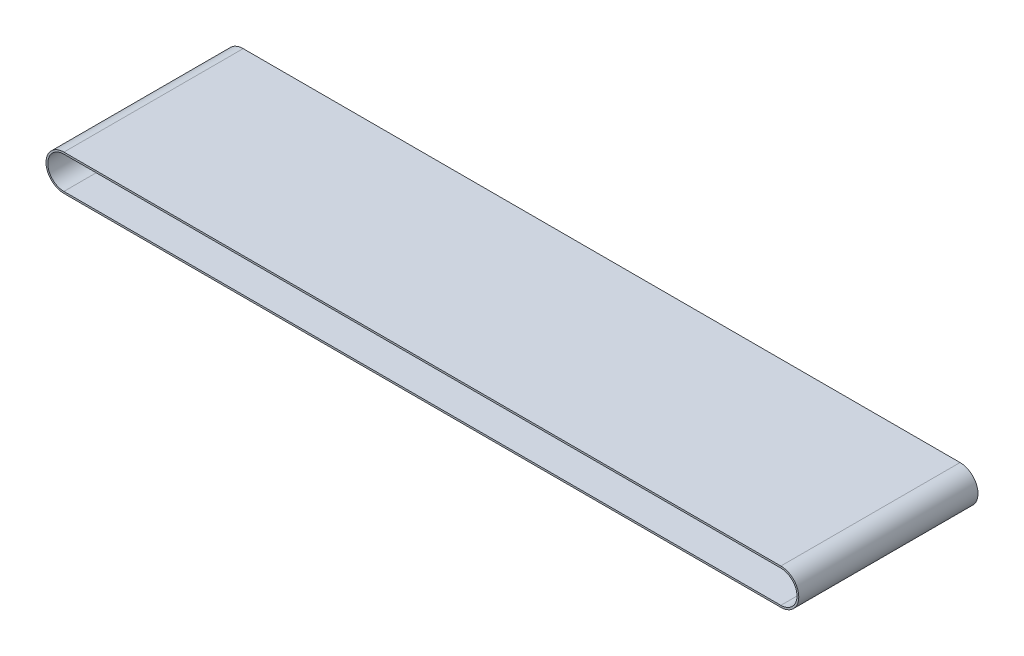
ISO-10303-21;
HEADER;
FILE_DESCRIPTION(('STEP AP214'),'2;1');
FILE_NAME('part.step','',(''),(''),'','','');
FILE_SCHEMA(('AUTOMOTIVE_DESIGN { 1 0 10303 214 1 1 1 1 }'));
ENDSEC;
DATA;
#1=APPLICATION_CONTEXT('core data for automotive mechanical design processes');
#2=APPLICATION_PROTOCOL_DEFINITION('international standard','automotive_design',2000,#1);
#3=PRODUCT_CONTEXT('',#1,'mechanical');
#4=PRODUCT('Part','Part','',(#3));
#5=PRODUCT_RELATED_PRODUCT_CATEGORY('part','',(#4));
#6=PRODUCT_DEFINITION_FORMATION('','',#4);
#7=PRODUCT_DEFINITION_CONTEXT('part definition',#1,'design');
#8=PRODUCT_DEFINITION('design','',#6,#7);
#9=PRODUCT_DEFINITION_SHAPE('','',#8);
#10=(LENGTH_UNIT() NAMED_UNIT(*) SI_UNIT(.MILLI.,.METRE.));
#11=(NAMED_UNIT(*) PLANE_ANGLE_UNIT() SI_UNIT($,.RADIAN.));
#12=(NAMED_UNIT(*) SI_UNIT($,.STERADIAN.) SOLID_ANGLE_UNIT());
#13=UNCERTAINTY_MEASURE_WITH_UNIT(LENGTH_MEASURE(1.E-05),#10,'distance_accuracy_value','');
#14=(GEOMETRIC_REPRESENTATION_CONTEXT(3) GLOBAL_UNCERTAINTY_ASSIGNED_CONTEXT((#13)) GLOBAL_UNIT_ASSIGNED_CONTEXT((#10,
#11,#12)) REPRESENTATION_CONTEXT('',''));
#15=CARTESIAN_POINT('',(0.,0.,0.));
#16=DIRECTION('',(0.,0.,1.));
#17=DIRECTION('',(1.,0.,0.));
#18=AXIS2_PLACEMENT_3D('',#15,#16,#17);
#19=CARTESIAN_POINT('',(0.,0.,1000.));
#20=DIRECTION('',(0.,0.,1.));
#21=DIRECTION('',(1.,0.,0.));
#22=AXIS2_PLACEMENT_3D('',#19,#20,#21);
#23=PLANE('',#22);
#24=CARTESIAN_POINT('',(0.,0.,1000.));
#25=DIRECTION('',(0.,0.,1.));
#26=DIRECTION('',(1.,0.,0.));
#27=AXIS2_PLACEMENT_3D('',#24,#25,#26);
#28=CIRCLE('',#27,100.);
#29=CARTESIAN_POINT('',(0.,100.,1000.));
#30=VERTEX_POINT('',#29);
#31=CARTESIAN_POINT('',(0.,-100.,1000.));
#32=VERTEX_POINT('',#31);
#33=EDGE_CURVE('E159',#30,#32,#28,.T.);
#34=ORIENTED_EDGE('',*,*,#33,.T.);
#35=DIRECTION('',(1.,0.,0.));
#36=VECTOR('',#35,1.);
#37=CARTESIAN_POINT('',(0.,-100.,1000.));
#38=LINE('',#37,#36);
#39=CARTESIAN_POINT('',(4000.,-100.,1000.));
#40=VERTEX_POINT('',#39);
#41=EDGE_CURVE('E163',#32,#40,#38,.T.);
#42=ORIENTED_EDGE('',*,*,#41,.T.);
#43=CARTESIAN_POINT('',(4000.,0.,1000.));
#44=DIRECTION('',(0.,0.,1.));
#45=DIRECTION('',(1.,0.,0.));
#46=AXIS2_PLACEMENT_3D('',#43,#44,#45);
#47=CIRCLE('',#46,100.);
#48=CARTESIAN_POINT('',(4000.,100.,1000.));
#49=VERTEX_POINT('',#48);
#50=EDGE_CURVE('E167',#40,#49,#47,.T.);
#51=ORIENTED_EDGE('',*,*,#50,.T.);
#52=DIRECTION('',(-1.,0.,0.));
#53=VECTOR('',#52,1.);
#54=CARTESIAN_POINT('',(0.,100.,1000.));
#55=LINE('',#54,#53);
#56=EDGE_CURVE('E170',#49,#30,#55,.T.);
#57=ORIENTED_EDGE('',*,*,#56,.T.);
#58=EDGE_LOOP('',(#34,#42,#51,#57));
#59=FACE_BOUND('',#58,.T.);
#60=DIRECTION('',(1.,0.,0.));
#61=VECTOR('',#60,1.);
#62=CARTESIAN_POINT('',(0.,-90.,1000.));
#63=LINE('',#62,#61);
#64=CARTESIAN_POINT('',(0.,-90.,1000.));
#65=VERTEX_POINT('',#64);
#66=CARTESIAN_POINT('',(4000.,-90.,1000.));
#67=VERTEX_POINT('',#66);
#68=EDGE_CURVE('E118',#65,#67,#63,.T.);
#69=ORIENTED_EDGE('',*,*,#68,.F.);
#70=CARTESIAN_POINT('',(0.,0.,1000.));
#71=DIRECTION('',(0.,0.,1.));
#72=DIRECTION('',(1.,0.,0.));
#73=AXIS2_PLACEMENT_3D('',#70,#71,#72);
#74=CIRCLE('',#73,90.);
#75=CARTESIAN_POINT('',(0.,90.,1000.));
#76=VERTEX_POINT('',#75);
#77=EDGE_CURVE('E109',#76,#65,#74,.T.);
#78=ORIENTED_EDGE('',*,*,#77,.F.);
#79=DIRECTION('',(-1.,0.,0.));
#80=VECTOR('',#79,1.);
#81=CARTESIAN_POINT('',(0.,90.,1000.));
#82=LINE('',#81,#80);
#83=CARTESIAN_POINT('',(4000.,90.,1000.));
#84=VERTEX_POINT('',#83);
#85=EDGE_CURVE('E137',#84,#76,#82,.T.);
#86=ORIENTED_EDGE('',*,*,#85,.F.);
#87=CARTESIAN_POINT('',(4000.,0.,1000.));
#88=DIRECTION('',(0.,0.,1.));
#89=DIRECTION('',(1.,0.,0.));
#90=AXIS2_PLACEMENT_3D('',#87,#88,#89);
#91=CIRCLE('',#90,90.);
#92=EDGE_CURVE('E131',#67,#84,#91,.T.);
#93=ORIENTED_EDGE('',*,*,#92,.F.);
#94=EDGE_LOOP('',(#69,#78,#86,#93));
#95=FACE_BOUND('',#94,.T.);
#96=ADVANCED_FACE('F43',(#59,#95),#23,.T.);
#97=CARTESIAN_POINT('',(0.,0.,0.));
#98=DIRECTION('',(0.,0.,1.));
#99=DIRECTION('',(1.,0.,0.));
#100=AXIS2_PLACEMENT_3D('',#97,#98,#99);
#101=PLANE('',#100);
#102=CARTESIAN_POINT('',(0.,0.,0.));
#103=DIRECTION('',(0.,0.,1.));
#104=DIRECTION('',(1.,0.,0.));
#105=AXIS2_PLACEMENT_3D('',#102,#103,#104);
#106=CIRCLE('',#105,100.);
#107=CARTESIAN_POINT('',(0.,100.,0.));
#108=VERTEX_POINT('',#107);
#109=CARTESIAN_POINT('',(0.,-100.,0.));
#110=VERTEX_POINT('',#109);
#111=EDGE_CURVE('E127',#108,#110,#106,.T.);
#112=ORIENTED_EDGE('',*,*,#111,.F.);
#113=DIRECTION('',(-1.,0.,0.));
#114=VECTOR('',#113,1.);
#115=CARTESIAN_POINT('',(0.,100.,0.));
#116=LINE('',#115,#114);
#117=CARTESIAN_POINT('',(4000.,100.,0.));
#118=VERTEX_POINT('',#117);
#119=EDGE_CURVE('E164',#118,#108,#116,.T.);
#120=ORIENTED_EDGE('',*,*,#119,.F.);
#121=CARTESIAN_POINT('',(4000.,0.,0.));
#122=DIRECTION('',(0.,0.,1.));
#123=DIRECTION('',(1.,0.,0.));
#124=AXIS2_PLACEMENT_3D('',#121,#122,#123);
#125=CIRCLE('',#124,100.);
#126=CARTESIAN_POINT('',(4000.,-100.,0.));
#127=VERTEX_POINT('',#126);
#128=EDGE_CURVE('E179',#127,#118,#125,.T.);
#129=ORIENTED_EDGE('',*,*,#128,.F.);
#130=DIRECTION('',(1.,0.,0.));
#131=VECTOR('',#130,1.);
#132=CARTESIAN_POINT('',(0.,-100.,0.));
#133=LINE('',#132,#131);
#134=EDGE_CURVE('E177',#110,#127,#133,.T.);
#135=ORIENTED_EDGE('',*,*,#134,.F.);
#136=EDGE_LOOP('',(#112,#120,#129,#135));
#137=FACE_BOUND('',#136,.T.);
#138=CARTESIAN_POINT('',(0.,0.,0.));
#139=DIRECTION('',(0.,0.,1.));
#140=DIRECTION('',(1.,0.,0.));
#141=AXIS2_PLACEMENT_3D('',#138,#139,#140);
#142=CIRCLE('',#141,90.);
#143=CARTESIAN_POINT('',(0.,90.,0.));
#144=VERTEX_POINT('',#143);
#145=CARTESIAN_POINT('',(0.,-90.,0.));
#146=VERTEX_POINT('',#145);
#147=EDGE_CURVE('E67',#144,#146,#142,.T.);
#148=ORIENTED_EDGE('',*,*,#147,.T.);
#149=DIRECTION('',(1.,0.,0.));
#150=VECTOR('',#149,1.);
#151=CARTESIAN_POINT('',(0.,-90.,0.));
#152=LINE('',#151,#150);
#153=CARTESIAN_POINT('',(4000.,-90.,0.));
#154=VERTEX_POINT('',#153);
#155=EDGE_CURVE('E125',#146,#154,#152,.T.);
#156=ORIENTED_EDGE('',*,*,#155,.T.);
#157=CARTESIAN_POINT('',(4000.,0.,0.));
#158=DIRECTION('',(0.,0.,1.));
#159=DIRECTION('',(1.,0.,0.));
#160=AXIS2_PLACEMENT_3D('',#157,#158,#159);
#161=CIRCLE('',#160,90.);
#162=CARTESIAN_POINT('',(4000.,90.,0.));
#163=VERTEX_POINT('',#162);
#164=EDGE_CURVE('E146',#154,#163,#161,.T.);
#165=ORIENTED_EDGE('',*,*,#164,.T.);
#166=DIRECTION('',(-1.,0.,0.));
#167=VECTOR('',#166,1.);
#168=CARTESIAN_POINT('',(0.,90.,0.));
#169=LINE('',#168,#167);
#170=EDGE_CURVE('E119',#163,#144,#169,.T.);
#171=ORIENTED_EDGE('',*,*,#170,.T.);
#172=EDGE_LOOP('',(#148,#156,#165,#171));
#173=FACE_BOUND('',#172,.T.);
#174=ADVANCED_FACE('F201',(#137,#173),#101,.F.);
#175=CARTESIAN_POINT('',(0.,0.,1000.));
#176=DIRECTION('',(0.,0.,-1.));
#177=DIRECTION('',(-1.,0.,0.));
#178=AXIS2_PLACEMENT_3D('',#175,#176,#177);
#179=CYLINDRICAL_SURFACE('',#178,100.);
#180=ORIENTED_EDGE('',*,*,#111,.T.);
#181=DIRECTION('',(0.,0.,-1.));
#182=VECTOR('',#181,1.);
#183=CARTESIAN_POINT('',(0.,-100.,1000.));
#184=LINE('',#183,#182);
#185=EDGE_CURVE('E11',#32,#110,#184,.T.);
#186=ORIENTED_EDGE('',*,*,#185,.F.);
#187=ORIENTED_EDGE('',*,*,#33,.F.);
#188=DIRECTION('',(0.,0.,-1.));
#189=VECTOR('',#188,1.);
#190=CARTESIAN_POINT('',(0.,100.,1000.));
#191=LINE('',#190,#189);
#192=EDGE_CURVE('E173',#30,#108,#191,.T.);
#193=ORIENTED_EDGE('',*,*,#192,.T.);
#194=EDGE_LOOP('',(#180,#186,#187,#193));
#195=FACE_BOUND('',#194,.T.);
#196=ADVANCED_FACE('F45',(#195),#179,.T.);
#197=CARTESIAN_POINT('',(0.,-100.,1000.));
#198=DIRECTION('',(0.,1.,0.));
#199=DIRECTION('',(0.,0.,1.));
#200=AXIS2_PLACEMENT_3D('',#197,#198,#199);
#201=PLANE('',#200);
#202=ORIENTED_EDGE('',*,*,#134,.T.);
#203=DIRECTION('',(0.,0.,-1.));
#204=VECTOR('',#203,1.);
#205=CARTESIAN_POINT('',(4000.,-100.,1000.));
#206=LINE('',#205,#204);
#207=EDGE_CURVE('E52',#40,#127,#206,.T.);
#208=ORIENTED_EDGE('',*,*,#207,.F.);
#209=ORIENTED_EDGE('',*,*,#41,.F.);
#210=ORIENTED_EDGE('',*,*,#185,.T.);
#211=EDGE_LOOP('',(#202,#208,#209,#210));
#212=FACE_BOUND('',#211,.T.);
#213=ADVANCED_FACE('F211',(#212),#201,.F.);
#214=CARTESIAN_POINT('',(4000.,0.,1000.));
#215=DIRECTION('',(0.,0.,-1.));
#216=DIRECTION('',(-1.,0.,0.));
#217=AXIS2_PLACEMENT_3D('',#214,#215,#216);
#218=CYLINDRICAL_SURFACE('',#217,100.);
#219=ORIENTED_EDGE('',*,*,#128,.T.);
#220=DIRECTION('',(0.,0.,-1.));
#221=VECTOR('',#220,1.);
#222=CARTESIAN_POINT('',(4000.,100.,1000.));
#223=LINE('',#222,#221);
#224=EDGE_CURVE('E187',#49,#118,#223,.T.);
#225=ORIENTED_EDGE('',*,*,#224,.F.);
#226=ORIENTED_EDGE('',*,*,#50,.F.);
#227=ORIENTED_EDGE('',*,*,#207,.T.);
#228=EDGE_LOOP('',(#219,#225,#226,#227));
#229=FACE_BOUND('',#228,.T.);
#230=ADVANCED_FACE('F195',(#229),#218,.T.);
#231=CARTESIAN_POINT('',(0.,100.,1000.));
#232=DIRECTION('',(0.,-1.,0.));
#233=DIRECTION('',(0.,0.,-1.));
#234=AXIS2_PLACEMENT_3D('',#231,#232,#233);
#235=PLANE('',#234);
#236=ORIENTED_EDGE('',*,*,#119,.T.);
#237=ORIENTED_EDGE('',*,*,#192,.F.);
#238=ORIENTED_EDGE('',*,*,#56,.F.);
#239=ORIENTED_EDGE('',*,*,#224,.T.);
#240=EDGE_LOOP('',(#236,#237,#238,#239));
#241=FACE_BOUND('',#240,.T.);
#242=ADVANCED_FACE('F205',(#241),#235,.F.);
#243=CARTESIAN_POINT('',(0.,0.,1000.));
#244=DIRECTION('',(0.,0.,-1.));
#245=DIRECTION('',(-1.,0.,0.));
#246=AXIS2_PLACEMENT_3D('',#243,#244,#245);
#247=CYLINDRICAL_SURFACE('',#246,90.);
#248=ORIENTED_EDGE('',*,*,#147,.F.);
#249=DIRECTION('',(0.,0.,-1.));
#250=VECTOR('',#249,1.);
#251=CARTESIAN_POINT('',(0.,90.,1000.));
#252=LINE('',#251,#250);
#253=EDGE_CURVE('E113',#76,#144,#252,.T.);
#254=ORIENTED_EDGE('',*,*,#253,.F.);
#255=ORIENTED_EDGE('',*,*,#77,.T.);
#256=DIRECTION('',(0.,0.,-1.));
#257=VECTOR('',#256,1.);
#258=CARTESIAN_POINT('',(0.,-90.,1000.));
#259=LINE('',#258,#257);
#260=EDGE_CURVE('E112',#65,#146,#259,.T.);
#261=ORIENTED_EDGE('',*,*,#260,.T.);
#262=EDGE_LOOP('',(#248,#254,#255,#261));
#263=FACE_BOUND('',#262,.T.);
#264=ADVANCED_FACE('F111',(#263),#247,.F.);
#265=CARTESIAN_POINT('',(0.,-90.,1000.));
#266=DIRECTION('',(0.,1.,0.));
#267=DIRECTION('',(0.,0.,1.));
#268=AXIS2_PLACEMENT_3D('',#265,#266,#267);
#269=PLANE('',#268);
#270=ORIENTED_EDGE('',*,*,#155,.F.);
#271=ORIENTED_EDGE('',*,*,#260,.F.);
#272=ORIENTED_EDGE('',*,*,#68,.T.);
#273=DIRECTION('',(0.,0.,-1.));
#274=VECTOR('',#273,1.);
#275=CARTESIAN_POINT('',(4000.,-90.,1000.));
#276=LINE('',#275,#274);
#277=EDGE_CURVE('E128',#67,#154,#276,.T.);
#278=ORIENTED_EDGE('',*,*,#277,.T.);
#279=EDGE_LOOP('',(#270,#271,#272,#278));
#280=FACE_BOUND('',#279,.T.);
#281=ADVANCED_FACE('F122',(#280),#269,.T.);
#282=CARTESIAN_POINT('',(4000.,0.,1000.));
#283=DIRECTION('',(0.,0.,-1.));
#284=DIRECTION('',(-1.,0.,0.));
#285=AXIS2_PLACEMENT_3D('',#282,#283,#284);
#286=CYLINDRICAL_SURFACE('',#285,90.);
#287=ORIENTED_EDGE('',*,*,#164,.F.);
#288=ORIENTED_EDGE('',*,*,#277,.F.);
#289=ORIENTED_EDGE('',*,*,#92,.T.);
#290=DIRECTION('',(0.,0.,-1.));
#291=VECTOR('',#290,1.);
#292=CARTESIAN_POINT('',(4000.,90.,1000.));
#293=LINE('',#292,#291);
#294=EDGE_CURVE('E59',#84,#163,#293,.T.);
#295=ORIENTED_EDGE('',*,*,#294,.T.);
#296=EDGE_LOOP('',(#287,#288,#289,#295));
#297=FACE_BOUND('',#296,.T.);
#298=ADVANCED_FACE('F234',(#297),#286,.F.);
#299=CARTESIAN_POINT('',(0.,90.,1000.));
#300=DIRECTION('',(0.,-1.,0.));
#301=DIRECTION('',(0.,0.,-1.));
#302=AXIS2_PLACEMENT_3D('',#299,#300,#301);
#303=PLANE('',#302);
#304=ORIENTED_EDGE('',*,*,#170,.F.);
#305=ORIENTED_EDGE('',*,*,#294,.F.);
#306=ORIENTED_EDGE('',*,*,#85,.T.);
#307=ORIENTED_EDGE('',*,*,#253,.T.);
#308=EDGE_LOOP('',(#304,#305,#306,#307));
#309=FACE_BOUND('',#308,.T.);
#310=ADVANCED_FACE('F238',(#309),#303,.T.);
#311=CLOSED_SHELL('',(#96,#174,#196,#213,#230,#242,#264,#281,#298,#310));
#312=MANIFOLD_SOLID_BREP('B2',#311);
#313=ADVANCED_BREP_SHAPE_REPRESENTATION('',(#18,#312),#14);
#314=SHAPE_DEFINITION_REPRESENTATION(#9,#313);
ENDSEC;
END-ISO-10303-21;
